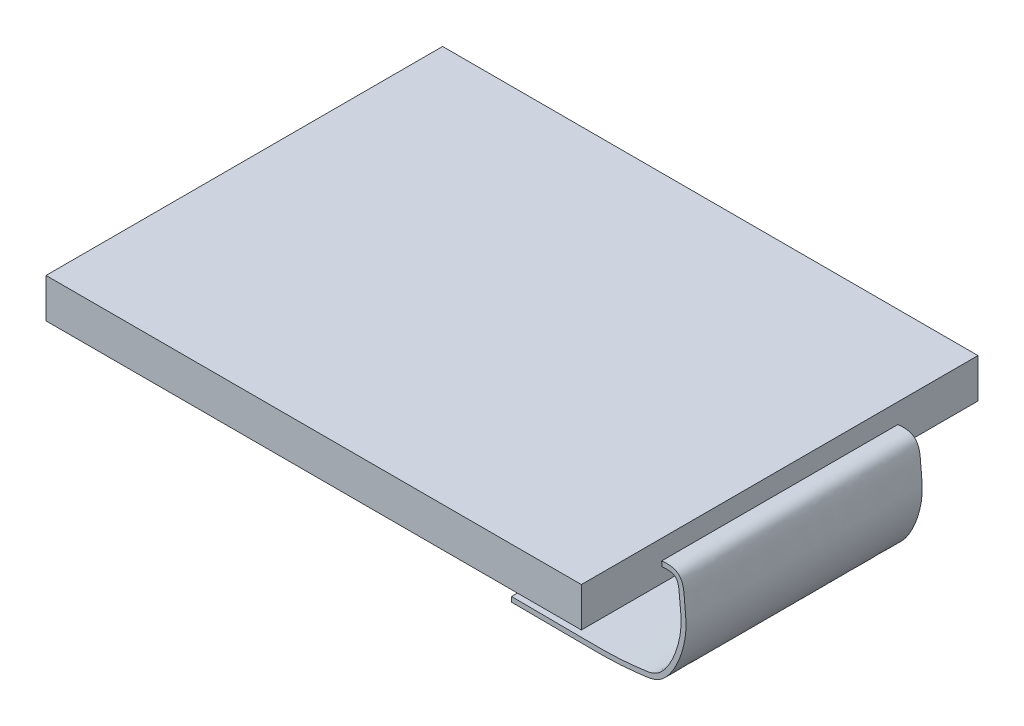
ISO-10303-21;
HEADER;
FILE_DESCRIPTION(('STEP AP214'),'2;1');
FILE_NAME('part.step','',(''),(''),'','','');
FILE_SCHEMA(('AUTOMOTIVE_DESIGN { 1 0 10303 214 1 1 1 1 }'));
ENDSEC;
DATA;
#1=APPLICATION_CONTEXT('core data for automotive mechanical design processes');
#2=APPLICATION_PROTOCOL_DEFINITION('international standard','automotive_design',2000,#1);
#3=PRODUCT_CONTEXT('',#1,'mechanical');
#4=PRODUCT('Part','Part','',(#3));
#5=PRODUCT_RELATED_PRODUCT_CATEGORY('part','',(#4));
#6=PRODUCT_DEFINITION_FORMATION('','',#4);
#7=PRODUCT_DEFINITION_CONTEXT('part definition',#1,'design');
#8=PRODUCT_DEFINITION('design','',#6,#7);
#9=PRODUCT_DEFINITION_SHAPE('','',#8);
#10=(LENGTH_UNIT() NAMED_UNIT(*) SI_UNIT(.MILLI.,.METRE.));
#11=(NAMED_UNIT(*) PLANE_ANGLE_UNIT() SI_UNIT($,.RADIAN.));
#12=(NAMED_UNIT(*) SI_UNIT($,.STERADIAN.) SOLID_ANGLE_UNIT());
#13=UNCERTAINTY_MEASURE_WITH_UNIT(LENGTH_MEASURE(1.E-05),#10,'distance_accuracy_value','');
#14=(GEOMETRIC_REPRESENTATION_CONTEXT(3) GLOBAL_UNCERTAINTY_ASSIGNED_CONTEXT((#13)) GLOBAL_UNIT_ASSIGNED_CONTEXT((#10,
#11,#12)) REPRESENTATION_CONTEXT('',''));
#15=CARTESIAN_POINT('',(0.,0.,0.));
#16=DIRECTION('',(0.,0.,1.));
#17=DIRECTION('',(1.,0.,0.));
#18=AXIS2_PLACEMENT_3D('',#15,#16,#17);
#19=CARTESIAN_POINT('',(11.9493701048832,-9.25171612656941,-12.));
#20=CARTESIAN_POINT('',(20.5345741170506,-9.25171612656941,-12.));
#21=CARTESIAN_POINT('',(21.5828849851652,-9.51116155336604,-12.));
#22=CARTESIAN_POINT('',(28.0366534439516,-8.66653709789183,-12.));
#23=CARTESIAN_POINT('',(29.9791234840881,-3.95738484897309,-12.));
#24=CARTESIAN_POINT('',(29.4028219934913,0.263414704009316,-12.));
#25=CARTESIAN_POINT('',(29.5639107348865,2.31200169036085,-12.));
#26=CARTESIAN_POINT('',(27.2,2.,-12.));
#27=B_SPLINE_CURVE_WITH_KNOTS('',3,(#19,#20,#21,#22,#23,#24,#25,#26),.UNSPECIFIED.,.F.,.F.,(4,1,
1,1,1,4),(0.,0.559948679735748,0.645825131349924,0.835104584498224,0.872888064527585,1.),.UNSPECIFIED.);
#28=DIRECTION('',(0.,0.,1.));
#29=VECTOR('',#28,1.);
#30=SURFACE_OF_LINEAR_EXTRUSION('',#27,#29);
#31=DIRECTION('',(0.,0.,1.));
#32=VECTOR('',#31,1.);
#33=CARTESIAN_POINT('',(27.2,2.,-12.));
#34=LINE('',#33,#32);
#35=CARTESIAN_POINT('',(27.2,2.,-12.));
#36=VERTEX_POINT('',#35);
#37=CARTESIAN_POINT('',(27.2,2.,12.));
#38=VERTEX_POINT('',#37);
#39=EDGE_CURVE('E46',#36,#38,#34,.T.);
#40=ORIENTED_EDGE('',*,*,#39,.T.);
#41=CARTESIAN_POINT('',(11.9493701048832,-9.25171612656941,12.));
#42=CARTESIAN_POINT('',(20.5345741170506,-9.25171612656941,12.));
#43=CARTESIAN_POINT('',(21.5828849851652,-9.51116155336604,12.));
#44=CARTESIAN_POINT('',(28.0366534439516,-8.66653709789183,12.));
#45=CARTESIAN_POINT('',(29.9791234840881,-3.95738484897309,12.));
#46=CARTESIAN_POINT('',(29.4028219934913,0.263414704009316,12.));
#47=CARTESIAN_POINT('',(29.5639107348865,2.31200169036085,12.));
#48=CARTESIAN_POINT('',(27.2,2.,12.));
#49=B_SPLINE_CURVE_WITH_KNOTS('',3,(#41,#42,#43,#44,#45,#46,#47,#48),.UNSPECIFIED.,.F.,.F.,(4,1,
1,1,1,4),(0.,0.559948679735748,0.645825131349924,0.835104584498224,0.872888064527585,1.),.UNSPECIFIED.);
#50=CARTESIAN_POINT('',(11.9493701048832,-9.25171612656941,12.));
#51=VERTEX_POINT('',#50);
#52=EDGE_CURVE('E83',#51,#38,#49,.T.);
#53=ORIENTED_EDGE('',*,*,#52,.F.);
#54=DIRECTION('',(0.,0.,1.));
#55=VECTOR('',#54,1.);
#56=CARTESIAN_POINT('',(11.9493701048832,-9.25171612656941,-12.));
#57=LINE('',#56,#55);
#58=CARTESIAN_POINT('',(11.9493701048832,-9.25171612656941,-12.));
#59=VERTEX_POINT('',#58);
#60=EDGE_CURVE('E12',#59,#51,#57,.T.);
#61=ORIENTED_EDGE('',*,*,#60,.F.);
#62=EDGE_CURVE('E84',#59,#36,#27,.T.);
#63=ORIENTED_EDGE('',*,*,#62,.T.);
#64=EDGE_LOOP('',(#40,#53,#61,#63));
#65=FACE_BOUND('',#64,.T.);
#66=ADVANCED_FACE('F42',(#65),#30,.T.);
#67=CARTESIAN_POINT('',(11.9493701048832,-8.75171612656941,-12.));
#68=DIRECTION('',(-1.,0.,0.));
#69=DIRECTION('',(0.,-1.,0.));
#70=AXIS2_PLACEMENT_3D('',#67,#68,#69);
#71=PLANE('',#70);
#72=ORIENTED_EDGE('',*,*,#60,.T.);
#73=DIRECTION('',(0.,-1.,0.));
#74=VECTOR('',#73,1.);
#75=CARTESIAN_POINT('',(11.9493701048832,-8.75171612656941,12.));
#76=LINE('',#75,#74);
#77=CARTESIAN_POINT('',(11.9493701048832,-8.75171612656941,12.));
#78=VERTEX_POINT('',#77);
#79=EDGE_CURVE('E100',#78,#51,#76,.T.);
#80=ORIENTED_EDGE('',*,*,#79,.F.);
#81=DIRECTION('',(0.,0.,1.));
#82=VECTOR('',#81,1.);
#83=CARTESIAN_POINT('',(11.9493701048832,-8.75171612656941,-12.));
#84=LINE('',#83,#82);
#85=CARTESIAN_POINT('',(11.9493701048832,-8.75171612656941,-12.));
#86=VERTEX_POINT('',#85);
#87=EDGE_CURVE('E51',#86,#78,#84,.T.);
#88=ORIENTED_EDGE('',*,*,#87,.F.);
#89=DIRECTION('',(0.,-1.,0.));
#90=VECTOR('',#89,1.);
#91=CARTESIAN_POINT('',(11.9493701048832,-8.75171612656941,-12.));
#92=LINE('',#91,#90);
#93=EDGE_CURVE('E89',#86,#59,#92,.T.);
#94=ORIENTED_EDGE('',*,*,#93,.T.);
#95=EDGE_LOOP('',(#72,#80,#88,#94));
#96=FACE_BOUND('',#95,.T.);
#97=ADVANCED_FACE('F135',(#96),#71,.T.);
#98=CARTESIAN_POINT('',(27.2654252984377,1.50429895065238,-12.));
#99=CARTESIAN_POINT('',(27.3861543988797,1.52023342857396,-12.));
#100=CARTESIAN_POINT('',(27.644982774349,1.54361928920554,-12.));
#101=CARTESIAN_POINT('',(28.0370837254082,1.53733483927289,-12.));
#102=CARTESIAN_POINT('',(28.3863973092867,1.45764056912672,-12.));
#103=CARTESIAN_POINT('',(28.6123007276754,1.31103210739467,-12.));
#104=CARTESIAN_POINT('',(28.7740489764296,1.10284330446542,-12.));
#105=CARTESIAN_POINT('',(28.9005566626159,0.771743174722894,-12.));
#106=CARTESIAN_POINT('',(29.0078662047459,0.185663717815578,-12.));
#107=CARTESIAN_POINT('',(29.0505398961035,-0.761010912214244,-12.));
#108=CARTESIAN_POINT('',(29.1945236424956,-1.89464945110353,-12.));
#109=CARTESIAN_POINT('',(29.1866371300475,-2.97229386134768,-12.));
#110=CARTESIAN_POINT('',(28.9960260075208,-4.14155125800557,-12.));
#111=CARTESIAN_POINT('',(28.5484368000702,-5.66053369440075,-12.));
#112=CARTESIAN_POINT('',(27.8605438855283,-7.00402693380992,-12.));
#113=CARTESIAN_POINT('',(27.0816126231157,-7.88953081427981,-12.));
#114=CARTESIAN_POINT('',(26.5291546228815,-8.24815464184718,-12.));
#115=CARTESIAN_POINT('',(25.9440249882603,-8.43066985480253,-12.));
#116=CARTESIAN_POINT('',(25.3088183880823,-8.51497167040763,-12.));
#117=CARTESIAN_POINT('',(24.6784593341216,-8.5861117320452,-12.));
#118=CARTESIAN_POINT('',(23.9174876476197,-8.66507028263554,-12.));
#119=CARTESIAN_POINT('',(23.0479165788626,-8.73623492382776,-12.));
#120=CARTESIAN_POINT('',(22.0555374800483,-8.78575581330642,-12.));
#121=CARTESIAN_POINT('',(21.0177947470536,-8.80706339417131,-12.));
#122=CARTESIAN_POINT('',(19.8447231165942,-8.80742853974953,-12.));
#123=CARTESIAN_POINT('',(18.4480073581402,-8.79421016733017,-12.));
#124=CARTESIAN_POINT('',(17.0254314528518,-8.77817486614104,-12.));
#125=CARTESIAN_POINT('',(15.6881451442954,-8.76614730656619,-12.));
#126=CARTESIAN_POINT('',(14.5755705316821,-8.75848013748379,-12.));
#127=CARTESIAN_POINT('',(13.5446252103529,-8.75401236538886,-12.));
#128=CARTESIAN_POINT('',(12.6595061303218,-8.75206679458812,-12.));
#129=CARTESIAN_POINT('',(12.1832763182142,-8.75171612656941,-12.));
#130=CARTESIAN_POINT('',(11.9493701048832,-8.75171612656941,-12.));
#131=B_SPLINE_CURVE_WITH_KNOTS('',3,(#98,#99,#100,#101,#102,#103,#104,#105,#106,#107,#108,#109,
#110,#111,#112,#113,#114,#115,#116,#117,#118,#119,#120,#121,#122,#123,#124,#125,#126,#127,#128,
#129,#130),.UNSPECIFIED.,.F.,.F.,(4,1,1,1,1,1,1,1,1,1,1,1,1,1,1,1,1,1,1,1,1,1,1,1,1,1,1,1,1,1,
4),(0.,0.0078125,0.015625,0.03125,0.046875,0.0625,0.078125,0.09375,0.125,0.15625,0.1875,0.21875,
0.25,0.3125,0.34375,0.375,0.40625,0.4375,0.46875,0.5,0.5625,0.625,0.6875,0.75,0.8125,0.875,
0.90625,0.9375,0.96875,0.984375,1.),.UNSPECIFIED.);
#132=DIRECTION('',(0.,0.,1.));
#133=VECTOR('',#132,1.);
#134=SURFACE_OF_LINEAR_EXTRUSION('',#131,#133);
#135=ORIENTED_EDGE('',*,*,#87,.T.);
#136=CARTESIAN_POINT('',(27.2654252984377,1.50429895065238,12.));
#137=CARTESIAN_POINT('',(27.3861543988797,1.52023342857396,12.));
#138=CARTESIAN_POINT('',(27.644982774349,1.54361928920554,12.));
#139=CARTESIAN_POINT('',(28.0370837254082,1.53733483927289,12.));
#140=CARTESIAN_POINT('',(28.3863973092867,1.45764056912672,12.));
#141=CARTESIAN_POINT('',(28.6123007276754,1.31103210739467,12.));
#142=CARTESIAN_POINT('',(28.7740489764296,1.10284330446542,12.));
#143=CARTESIAN_POINT('',(28.9005566626159,0.771743174722894,12.));
#144=CARTESIAN_POINT('',(29.0078662047459,0.185663717815578,12.));
#145=CARTESIAN_POINT('',(29.0505398961035,-0.761010912214244,12.));
#146=CARTESIAN_POINT('',(29.1945236424956,-1.89464945110353,12.));
#147=CARTESIAN_POINT('',(29.1866371300475,-2.97229386134768,12.));
#148=CARTESIAN_POINT('',(28.9960260075208,-4.14155125800557,12.));
#149=CARTESIAN_POINT('',(28.5484368000702,-5.66053369440075,12.));
#150=CARTESIAN_POINT('',(27.8605438855283,-7.00402693380992,12.));
#151=CARTESIAN_POINT('',(27.0816126231157,-7.88953081427981,12.));
#152=CARTESIAN_POINT('',(26.5291546228815,-8.24815464184718,12.));
#153=CARTESIAN_POINT('',(25.9440249882603,-8.43066985480253,12.));
#154=CARTESIAN_POINT('',(25.3088183880823,-8.51497167040763,12.));
#155=CARTESIAN_POINT('',(24.6784593341216,-8.5861117320452,12.));
#156=CARTESIAN_POINT('',(23.9174876476197,-8.66507028263554,12.));
#157=CARTESIAN_POINT('',(23.0479165788626,-8.73623492382776,12.));
#158=CARTESIAN_POINT('',(22.0555374800483,-8.78575581330642,12.));
#159=CARTESIAN_POINT('',(21.0177947470536,-8.80706339417131,12.));
#160=CARTESIAN_POINT('',(19.8447231165942,-8.80742853974953,12.));
#161=CARTESIAN_POINT('',(18.4480073581402,-8.79421016733017,12.));
#162=CARTESIAN_POINT('',(17.0254314528518,-8.77817486614104,12.));
#163=CARTESIAN_POINT('',(15.6881451442954,-8.76614730656619,12.));
#164=CARTESIAN_POINT('',(14.5755705316821,-8.75848013748379,12.));
#165=CARTESIAN_POINT('',(13.5446252103529,-8.75401236538886,12.));
#166=CARTESIAN_POINT('',(12.6595061303218,-8.75206679458812,12.));
#167=CARTESIAN_POINT('',(12.1832763182142,-8.75171612656941,12.));
#168=CARTESIAN_POINT('',(11.9493701048832,-8.75171612656941,12.));
#169=B_SPLINE_CURVE_WITH_KNOTS('',3,(#136,#137,#138,#139,#140,#141,#142,#143,#144,#145,#146,
#147,#148,#149,#150,#151,#152,#153,#154,#155,#156,#157,#158,#159,#160,#161,#162,#163,#164,#165,
#166,#167,#168),.UNSPECIFIED.,.F.,.F.,(4,1,1,1,1,1,1,1,1,1,1,1,1,1,1,1,1,1,1,1,1,1,1,1,1,1,1,1,
1,1,4),(0.,0.0078125,0.015625,0.03125,0.046875,0.0625,0.078125,0.09375,0.125,0.15625,0.1875,
0.21875,0.25,0.3125,0.34375,0.375,0.40625,0.4375,0.46875,0.5,0.5625,0.625,0.6875,0.75,0.8125,
0.875,0.90625,0.9375,0.96875,0.984375,1.),.UNSPECIFIED.);
#170=CARTESIAN_POINT('',(27.2654252984377,1.50429895065238,12.));
#171=VERTEX_POINT('',#170);
#172=EDGE_CURVE('E96',#171,#78,#169,.T.);
#173=ORIENTED_EDGE('',*,*,#172,.F.);
#174=DIRECTION('',(0.,0.,1.));
#175=VECTOR('',#174,1.);
#176=CARTESIAN_POINT('',(27.2654252984377,1.50429895065238,-12.));
#177=LINE('',#176,#175);
#178=CARTESIAN_POINT('',(27.2654252984377,1.50429895065238,-12.));
#179=VERTEX_POINT('',#178);
#180=EDGE_CURVE('E88',#179,#171,#177,.T.);
#181=ORIENTED_EDGE('',*,*,#180,.F.);
#182=EDGE_CURVE('E123',#179,#86,#131,.T.);
#183=ORIENTED_EDGE('',*,*,#182,.T.);
#184=EDGE_LOOP('',(#135,#173,#181,#183));
#185=FACE_BOUND('',#184,.T.);
#186=ADVANCED_FACE('F132',(#185),#134,.T.);
#187=CARTESIAN_POINT('',(27.2,2.,-12.));
#188=DIRECTION('',(-0.991402098695245,-0.130850596875461,0.));
#189=DIRECTION('',(0.130850596875461,-0.991402098695245,0.));
#190=AXIS2_PLACEMENT_3D('',#187,#188,#189);
#191=PLANE('',#190);
#192=ORIENTED_EDGE('',*,*,#180,.T.);
#193=DIRECTION('',(0.130850596875461,-0.991402098695245,0.));
#194=VECTOR('',#193,1.);
#195=CARTESIAN_POINT('',(27.2,2.,12.));
#196=LINE('',#195,#194);
#197=EDGE_CURVE('E91',#38,#171,#196,.T.);
#198=ORIENTED_EDGE('',*,*,#197,.F.);
#199=ORIENTED_EDGE('',*,*,#39,.F.);
#200=DIRECTION('',(0.130850596875461,-0.991402098695245,0.));
#201=VECTOR('',#200,1.);
#202=CARTESIAN_POINT('',(27.2,2.,-12.));
#203=LINE('',#202,#201);
#204=EDGE_CURVE('E118',#36,#179,#203,.T.);
#205=ORIENTED_EDGE('',*,*,#204,.T.);
#206=EDGE_LOOP('',(#192,#198,#199,#205));
#207=FACE_BOUND('',#206,.T.);
#208=ADVANCED_FACE('F92',(#207),#191,.T.);
#209=CARTESIAN_POINT('',(24.1612597585138,-9.14117741266214,-12.));
#210=DIRECTION('',(0.,0.,1.));
#211=DIRECTION('',(1.,0.,0.));
#212=AXIS2_PLACEMENT_3D('',#209,#210,#211);
#213=PLANE('',#212);
#214=ORIENTED_EDGE('',*,*,#62,.F.);
#215=ORIENTED_EDGE('',*,*,#93,.F.);
#216=ORIENTED_EDGE('',*,*,#182,.F.);
#217=ORIENTED_EDGE('',*,*,#204,.F.);
#218=EDGE_LOOP('',(#214,#215,#216,#217));
#219=FACE_BOUND('',#218,.T.);
#220=ADVANCED_FACE('F139',(#219),#213,.F.);
#221=CARTESIAN_POINT('',(24.1612597585138,-9.14117741266214,12.));
#222=DIRECTION('',(0.,0.,1.));
#223=DIRECTION('',(1.,0.,0.));
#224=AXIS2_PLACEMENT_3D('',#221,#222,#223);
#225=PLANE('',#224);
#226=ORIENTED_EDGE('',*,*,#52,.T.);
#227=ORIENTED_EDGE('',*,*,#197,.T.);
#228=ORIENTED_EDGE('',*,*,#172,.T.);
#229=ORIENTED_EDGE('',*,*,#79,.T.);
#230=EDGE_LOOP('',(#226,#227,#228,#229));
#231=FACE_BOUND('',#230,.T.);
#232=ADVANCED_FACE('F99',(#231),#225,.T.);
#233=CLOSED_SHELL('',(#66,#97,#186,#208,#220,#232));
#234=MANIFOLD_SOLID_BREP('B2',#233);
#235=CARTESIAN_POINT('',(-27.2,4.,-20.15));
#236=DIRECTION('',(1.,0.,0.));
#237=DIRECTION('',(0.,0.,-1.));
#238=AXIS2_PLACEMENT_3D('',#235,#236,#237);
#239=PLANE('',#238);
#240=DIRECTION('',(0.,0.,1.));
#241=VECTOR('',#240,1.);
#242=CARTESIAN_POINT('',(-27.2,0.,-20.15));
#243=LINE('',#242,#241);
#244=CARTESIAN_POINT('',(-27.2,0.,-20.15));
#245=VERTEX_POINT('',#244);
#246=CARTESIAN_POINT('',(-27.2,0.,20.15));
#247=VERTEX_POINT('',#246);
#248=EDGE_CURVE('E250',#245,#247,#243,.T.);
#249=ORIENTED_EDGE('',*,*,#248,.T.);
#250=DIRECTION('',(0.,-1.,0.));
#251=VECTOR('',#250,1.);
#252=CARTESIAN_POINT('',(-27.2,4.,20.15));
#253=LINE('',#252,#251);
#254=CARTESIAN_POINT('',(-27.2,4.,20.15));
#255=VERTEX_POINT('',#254);
#256=EDGE_CURVE('E40',#255,#247,#253,.T.);
#257=ORIENTED_EDGE('',*,*,#256,.F.);
#258=DIRECTION('',(0.,0.,1.));
#259=VECTOR('',#258,1.);
#260=CARTESIAN_POINT('',(-27.2,4.,-20.15));
#261=LINE('',#260,#259);
#262=CARTESIAN_POINT('',(-27.2,4.,-20.15));
#263=VERTEX_POINT('',#262);
#264=EDGE_CURVE('E238',#263,#255,#261,.T.);
#265=ORIENTED_EDGE('',*,*,#264,.F.);
#266=DIRECTION('',(0.,-1.,0.));
#267=VECTOR('',#266,1.);
#268=CARTESIAN_POINT('',(-27.2,4.,-20.15));
#269=LINE('',#268,#267);
#270=EDGE_CURVE('E246',#263,#245,#269,.T.);
#271=ORIENTED_EDGE('',*,*,#270,.T.);
#272=EDGE_LOOP('',(#249,#257,#265,#271));
#273=FACE_BOUND('',#272,.T.);
#274=ADVANCED_FACE('F187',(#273),#239,.F.);
#275=CARTESIAN_POINT('',(-27.2,4.,20.15));
#276=DIRECTION('',(0.,0.,-1.));
#277=DIRECTION('',(-1.,0.,0.));
#278=AXIS2_PLACEMENT_3D('',#275,#276,#277);
#279=PLANE('',#278);
#280=DIRECTION('',(1.,0.,0.));
#281=VECTOR('',#280,1.);
#282=CARTESIAN_POINT('',(-27.2,0.,20.15));
#283=LINE('',#282,#281);
#284=CARTESIAN_POINT('',(27.2,0.,20.15));
#285=VERTEX_POINT('',#284);
#286=EDGE_CURVE('E242',#247,#285,#283,.T.);
#287=ORIENTED_EDGE('',*,*,#286,.T.);
#288=DIRECTION('',(0.,-1.,0.));
#289=VECTOR('',#288,1.);
#290=CARTESIAN_POINT('',(27.2,4.,20.15));
#291=LINE('',#290,#289);
#292=CARTESIAN_POINT('',(27.2,4.,20.15));
#293=VERTEX_POINT('',#292);
#294=EDGE_CURVE('E195',#293,#285,#291,.T.);
#295=ORIENTED_EDGE('',*,*,#294,.F.);
#296=DIRECTION('',(1.,0.,0.));
#297=VECTOR('',#296,1.);
#298=CARTESIAN_POINT('',(-27.2,4.,20.15));
#299=LINE('',#298,#297);
#300=EDGE_CURVE('E233',#255,#293,#299,.T.);
#301=ORIENTED_EDGE('',*,*,#300,.F.);
#302=ORIENTED_EDGE('',*,*,#256,.T.);
#303=EDGE_LOOP('',(#287,#295,#301,#302));
#304=FACE_BOUND('',#303,.T.);
#305=ADVANCED_FACE('F241',(#304),#279,.F.);
#306=CARTESIAN_POINT('',(27.2,4.,-20.15));
#307=DIRECTION('',(-1.,0.,0.));
#308=DIRECTION('',(0.,0.,1.));
#309=AXIS2_PLACEMENT_3D('',#306,#307,#308);
#310=PLANE('',#309);
#311=DIRECTION('',(0.,0.,-1.));
#312=VECTOR('',#311,1.);
#313=CARTESIAN_POINT('',(27.2,0.,-20.15));
#314=LINE('',#313,#312);
#315=CARTESIAN_POINT('',(27.2,0.,-20.15));
#316=VERTEX_POINT('',#315);
#317=EDGE_CURVE('E220',#285,#316,#314,.T.);
#318=ORIENTED_EDGE('',*,*,#317,.T.);
#319=DIRECTION('',(0.,-1.,0.));
#320=VECTOR('',#319,1.);
#321=CARTESIAN_POINT('',(27.2,4.,-20.15));
#322=LINE('',#321,#320);
#323=CARTESIAN_POINT('',(27.2,4.,-20.15));
#324=VERTEX_POINT('',#323);
#325=EDGE_CURVE('E243',#324,#316,#322,.T.);
#326=ORIENTED_EDGE('',*,*,#325,.F.);
#327=DIRECTION('',(0.,0.,-1.));
#328=VECTOR('',#327,1.);
#329=CARTESIAN_POINT('',(27.2,4.,-20.15));
#330=LINE('',#329,#328);
#331=EDGE_CURVE('E236',#293,#324,#330,.T.);
#332=ORIENTED_EDGE('',*,*,#331,.F.);
#333=ORIENTED_EDGE('',*,*,#294,.T.);
#334=EDGE_LOOP('',(#318,#326,#332,#333));
#335=FACE_BOUND('',#334,.T.);
#336=ADVANCED_FACE('F244',(#335),#310,.F.);
#337=CARTESIAN_POINT('',(-27.2,4.,-20.15));
#338=DIRECTION('',(0.,0.,1.));
#339=DIRECTION('',(1.,0.,0.));
#340=AXIS2_PLACEMENT_3D('',#337,#338,#339);
#341=PLANE('',#340);
#342=DIRECTION('',(-1.,0.,0.));
#343=VECTOR('',#342,1.);
#344=CARTESIAN_POINT('',(-27.2,0.,-20.15));
#345=LINE('',#344,#343);
#346=EDGE_CURVE('E226',#316,#245,#345,.T.);
#347=ORIENTED_EDGE('',*,*,#346,.T.);
#348=ORIENTED_EDGE('',*,*,#270,.F.);
#349=DIRECTION('',(-1.,0.,0.));
#350=VECTOR('',#349,1.);
#351=CARTESIAN_POINT('',(-27.2,4.,-20.15));
#352=LINE('',#351,#350);
#353=EDGE_CURVE('E203',#324,#263,#352,.T.);
#354=ORIENTED_EDGE('',*,*,#353,.F.);
#355=ORIENTED_EDGE('',*,*,#325,.T.);
#356=EDGE_LOOP('',(#347,#348,#354,#355));
#357=FACE_BOUND('',#356,.T.);
#358=ADVANCED_FACE('F257',(#357),#341,.F.);
#359=CARTESIAN_POINT('',(0.,4.,0.));
#360=DIRECTION('',(0.,1.,0.));
#361=DIRECTION('',(0.,0.,1.));
#362=AXIS2_PLACEMENT_3D('',#359,#360,#361);
#363=PLANE('',#362);
#364=ORIENTED_EDGE('',*,*,#264,.T.);
#365=ORIENTED_EDGE('',*,*,#300,.T.);
#366=ORIENTED_EDGE('',*,*,#331,.T.);
#367=ORIENTED_EDGE('',*,*,#353,.T.);
#368=EDGE_LOOP('',(#364,#365,#366,#367));
#369=FACE_BOUND('',#368,.T.);
#370=ADVANCED_FACE('F234',(#369),#363,.T.);
#371=CARTESIAN_POINT('',(0.,0.,0.));
#372=DIRECTION('',(0.,1.,0.));
#373=DIRECTION('',(0.,0.,1.));
#374=AXIS2_PLACEMENT_3D('',#371,#372,#373);
#375=PLANE('',#374);
#376=ORIENTED_EDGE('',*,*,#248,.F.);
#377=ORIENTED_EDGE('',*,*,#346,.F.);
#378=ORIENTED_EDGE('',*,*,#317,.F.);
#379=ORIENTED_EDGE('',*,*,#286,.F.);
#380=EDGE_LOOP('',(#376,#377,#378,#379));
#381=FACE_BOUND('',#380,.T.);
#382=ADVANCED_FACE('F260',(#381),#375,.F.);
#383=CLOSED_SHELL('',(#274,#305,#336,#358,#370,#382));
#384=MANIFOLD_SOLID_BREP('B6',#383);
#385=ADVANCED_BREP_SHAPE_REPRESENTATION('',(#18,#234,#384),#14);
#386=SHAPE_DEFINITION_REPRESENTATION(#9,#385);
ENDSEC;
END-ISO-10303-21;
